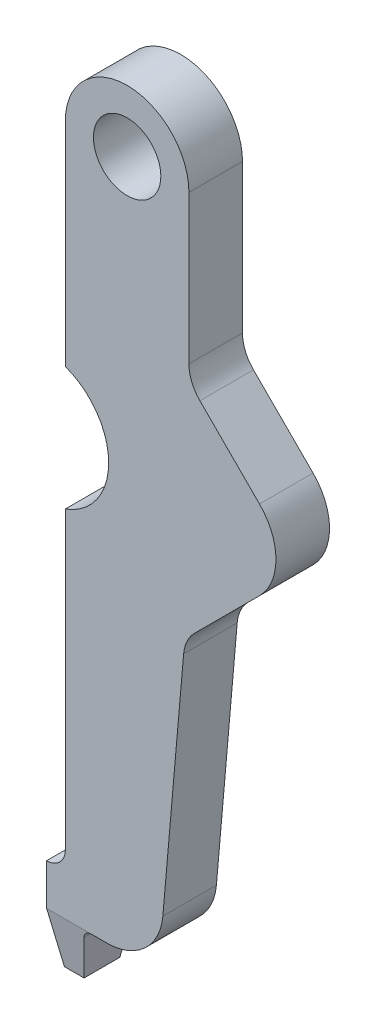
ISO-10303-21;
HEADER;
FILE_DESCRIPTION(('STEP AP214'),'2;1');
FILE_NAME('part.step','',(''),(''),'','','');
FILE_SCHEMA(('AUTOMOTIVE_DESIGN { 1 0 10303 214 1 1 1 1 }'));
ENDSEC;
DATA;
#1=APPLICATION_CONTEXT('core data for automotive mechanical design processes');
#2=APPLICATION_PROTOCOL_DEFINITION('international standard','automotive_design',2000,#1);
#3=PRODUCT_CONTEXT('',#1,'mechanical');
#4=PRODUCT('Part','Part','',(#3));
#5=PRODUCT_RELATED_PRODUCT_CATEGORY('part','',(#4));
#6=PRODUCT_DEFINITION_FORMATION('','',#4);
#7=PRODUCT_DEFINITION_CONTEXT('part definition',#1,'design');
#8=PRODUCT_DEFINITION('design','',#6,#7);
#9=PRODUCT_DEFINITION_SHAPE('','',#8);
#10=(LENGTH_UNIT() NAMED_UNIT(*) SI_UNIT(.MILLI.,.METRE.));
#11=(NAMED_UNIT(*) PLANE_ANGLE_UNIT() SI_UNIT($,.RADIAN.));
#12=(NAMED_UNIT(*) SI_UNIT($,.STERADIAN.) SOLID_ANGLE_UNIT());
#13=UNCERTAINTY_MEASURE_WITH_UNIT(LENGTH_MEASURE(1.E-05),#10,'distance_accuracy_value','');
#14=(GEOMETRIC_REPRESENTATION_CONTEXT(3) GLOBAL_UNCERTAINTY_ASSIGNED_CONTEXT((#13)) GLOBAL_UNIT_ASSIGNED_CONTEXT((#10,
#11,#12)) REPRESENTATION_CONTEXT('',''));
#15=CARTESIAN_POINT('',(0.,0.,0.));
#16=DIRECTION('',(0.,0.,1.));
#17=DIRECTION('',(1.,0.,0.));
#18=AXIS2_PLACEMENT_3D('',#15,#16,#17);
#19=CARTESIAN_POINT('',(0.,0.,1.8161));
#20=DIRECTION('',(1.,0.,0.));
#21=DIRECTION('',(0.,0.,-1.));
#22=AXIS2_PLACEMENT_3D('',#19,#20,#21);
#23=PLANE('',#22);
#24=DIRECTION('',(0.,-1.,0.));
#25=VECTOR('',#24,1.);
#26=CARTESIAN_POINT('',(0.,0.,-1.8161));
#27=LINE('',#26,#25);
#28=CARTESIAN_POINT('',(0.,44.069,-1.8161));
#29=VERTEX_POINT('',#28);
#30=CARTESIAN_POINT('',(0.,29.6532687366891,-1.8161));
#31=VERTEX_POINT('',#30);
#32=EDGE_CURVE('E183',#29,#31,#27,.T.);
#33=ORIENTED_EDGE('',*,*,#32,.T.);
#34=DIRECTION('',(0.,0.,1.));
#35=VECTOR('',#34,1.);
#36=CARTESIAN_POINT('',(0.,29.6532687366891,-1.8161));
#37=LINE('',#36,#35);
#38=CARTESIAN_POINT('',(0.,29.6532687366891,1.8161));
#39=VERTEX_POINT('',#38);
#40=EDGE_CURVE('E54',#31,#39,#37,.T.);
#41=ORIENTED_EDGE('',*,*,#40,.T.);
#42=DIRECTION('',(0.,-1.,0.));
#43=VECTOR('',#42,1.);
#44=CARTESIAN_POINT('',(0.,0.,1.8161));
#45=LINE('',#44,#43);
#46=CARTESIAN_POINT('',(0.,44.069,1.8161));
#47=VERTEX_POINT('',#46);
#48=EDGE_CURVE('E196',#47,#39,#45,.T.);
#49=ORIENTED_EDGE('',*,*,#48,.F.);
#50=DIRECTION('',(0.,0.,-1.));
#51=VECTOR('',#50,1.);
#52=CARTESIAN_POINT('',(0.,44.069,1.8161));
#53=LINE('',#52,#51);
#54=EDGE_CURVE('E199',#47,#29,#53,.T.);
#55=ORIENTED_EDGE('',*,*,#54,.T.);
#56=EDGE_LOOP('',(#33,#41,#49,#55));
#57=FACE_BOUND('',#56,.T.);
#58=ADVANCED_FACE('F37',(#57),#23,.F.);
#59=CARTESIAN_POINT('',(6.5532,-2.794,1.8161));
#60=DIRECTION('',(0.,1.,0.));
#61=DIRECTION('',(-1.,0.,0.));
#62=AXIS2_PLACEMENT_3D('',#59,#60,#61);
#63=PLANE('',#62);
#64=DIRECTION('',(-1.,0.,0.));
#65=VECTOR('',#64,1.);
#66=CARTESIAN_POINT('',(6.5532,-2.794,1.8161));
#67=LINE('',#66,#65);
#68=CARTESIAN_POINT('',(2.81753490110218,-2.794,1.8161));
#69=VERTEX_POINT('',#68);
#70=CARTESIAN_POINT('',(1.80282826579757,-2.794,1.8161));
#71=VERTEX_POINT('',#70);
#72=EDGE_CURVE('E247',#69,#71,#67,.T.);
#73=ORIENTED_EDGE('',*,*,#72,.T.);
#74=DIRECTION('',(0.,0.,-1.));
#75=VECTOR('',#74,1.);
#76=CARTESIAN_POINT('',(1.80282826579757,-2.794,-1.8161));
#77=LINE('',#76,#75);
#78=CARTESIAN_POINT('',(1.80282826579757,-2.794,-1.8161));
#79=VERTEX_POINT('',#78);
#80=EDGE_CURVE('E223',#71,#79,#77,.T.);
#81=ORIENTED_EDGE('',*,*,#80,.T.);
#82=DIRECTION('',(1.,0.,0.));
#83=VECTOR('',#82,1.);
#84=CARTESIAN_POINT('',(6.5532,-2.794,-1.8161));
#85=LINE('',#84,#83);
#86=CARTESIAN_POINT('',(2.81753490110218,-2.794,-1.8161));
#87=VERTEX_POINT('',#86);
#88=EDGE_CURVE('E207',#79,#87,#85,.T.);
#89=ORIENTED_EDGE('',*,*,#88,.T.);
#90=DIRECTION('',(0.,0.,1.));
#91=VECTOR('',#90,1.);
#92=CARTESIAN_POINT('',(2.81753490110218,-2.794,1.8161));
#93=LINE('',#92,#91);
#94=EDGE_CURVE('E278',#87,#69,#93,.T.);
#95=ORIENTED_EDGE('',*,*,#94,.T.);
#96=EDGE_LOOP('',(#73,#81,#89,#95));
#97=FACE_BOUND('',#96,.T.);
#98=ADVANCED_FACE('F313',(#97),#63,.F.);
#99=CARTESIAN_POINT('',(8.10282910605329,17.7123417320712,1.8161));
#100=DIRECTION('',(-0.996194698091746,0.0871557427476543,0.));
#101=DIRECTION('',(-0.0871557427476543,-0.996194698091746,0.));
#102=AXIS2_PLACEMENT_3D('',#99,#100,#101);
#103=PLANE('',#102);
#104=DIRECTION('',(0.0871557427476543,0.996194698091746,0.));
#105=VECTOR('',#104,1.);
#106=CARTESIAN_POINT('',(8.10282910605329,17.7123417320712,1.8161));
#107=LINE('',#106,#105);
#108=CARTESIAN_POINT('',(6.61303670083174,0.683936620131439,1.8161));
#109=VERTEX_POINT('',#108);
#110=CARTESIAN_POINT('',(8.0222549819453,16.7913752792676,1.8161));
#111=VERTEX_POINT('',#110);
#112=EDGE_CURVE('E186',#109,#111,#107,.T.);
#113=ORIENTED_EDGE('',*,*,#112,.F.);
#114=DIRECTION('',(0.,0.,1.));
#115=VECTOR('',#114,1.);
#116=CARTESIAN_POINT('',(6.61303670083173,0.683936620131435,1.8161));
#117=LINE('',#116,#115);
#118=CARTESIAN_POINT('',(6.61303670083174,0.683936620131439,-1.8161));
#119=VERTEX_POINT('',#118);
#120=EDGE_CURVE('E284',#109,#119,#117,.F.);
#121=ORIENTED_EDGE('',*,*,#120,.T.);
#122=DIRECTION('',(0.0871557427476543,0.996194698091746,0.));
#123=VECTOR('',#122,1.);
#124=CARTESIAN_POINT('',(8.10282910605329,17.7123417320712,-1.8161));
#125=LINE('',#124,#123);
#126=CARTESIAN_POINT('',(8.0222549819453,16.7913752792676,-1.8161));
#127=VERTEX_POINT('',#126);
#128=EDGE_CURVE('E245',#119,#127,#125,.T.);
#129=ORIENTED_EDGE('',*,*,#128,.T.);
#130=DIRECTION('',(0.,0.,-1.));
#131=VECTOR('',#130,1.);
#132=CARTESIAN_POINT('',(8.0222549819453,16.7913752792676,1.8161));
#133=LINE('',#132,#131);
#134=EDGE_CURVE('E352',#127,#111,#133,.F.);
#135=ORIENTED_EDGE('',*,*,#134,.T.);
#136=EDGE_LOOP('',(#113,#121,#129,#135));
#137=FACE_BOUND('',#136,.T.);
#138=ADVANCED_FACE('F398',(#137),#103,.F.);
#139=CARTESIAN_POINT('',(8.10282910605329,17.7123417320712,1.8161));
#140=DIRECTION('',(-0.707106781186544,0.707106781186551,0.));
#141=DIRECTION('',(-0.707106781186551,-0.707106781186544,0.));
#142=AXIS2_PLACEMENT_3D('',#139,#140,#141);
#143=PLANE('',#142);
#144=DIRECTION('',(0.707106781186551,0.707106781186544,0.));
#145=VECTOR('',#144,1.);
#146=CARTESIAN_POINT('',(8.10282910605329,17.7123417320712,1.8161));
#147=LINE('',#146,#145);
#148=CARTESIAN_POINT('',(8.75653829088451,18.3660509169024,1.8161));
#149=VERTEX_POINT('',#148);
#150=CARTESIAN_POINT('',(13.1670591253803,22.7765717513982,1.8161));
#151=VERTEX_POINT('',#150);
#152=EDGE_CURVE('E317',#149,#151,#147,.T.);
#153=ORIENTED_EDGE('',*,*,#152,.F.);
#154=DIRECTION('',(0.,0.,-1.));
#155=VECTOR('',#154,1.);
#156=CARTESIAN_POINT('',(8.75653829088451,18.3660509169024,-1.8161));
#157=LINE('',#156,#155);
#158=CARTESIAN_POINT('',(8.75653829088451,18.3660509169024,-1.8161));
#159=VERTEX_POINT('',#158);
#160=EDGE_CURVE('E349',#149,#159,#157,.T.);
#161=ORIENTED_EDGE('',*,*,#160,.T.);
#162=DIRECTION('',(0.707106781186551,0.707106781186544,0.));
#163=VECTOR('',#162,1.);
#164=CARTESIAN_POINT('',(8.10282910605329,17.7123417320712,-1.8161));
#165=LINE('',#164,#163);
#166=CARTESIAN_POINT('',(13.1670591253803,22.7765717513982,-1.8161));
#167=VERTEX_POINT('',#166);
#168=EDGE_CURVE('E327',#159,#167,#165,.T.);
#169=ORIENTED_EDGE('',*,*,#168,.T.);
#170=DIRECTION('',(0.,0.,-1.));
#171=VECTOR('',#170,1.);
#172=CARTESIAN_POINT('',(13.1670591253803,22.7765717513982,1.8161));
#173=LINE('',#172,#171);
#174=EDGE_CURVE('E344',#167,#151,#173,.F.);
#175=ORIENTED_EDGE('',*,*,#174,.T.);
#176=EDGE_LOOP('',(#153,#161,#169,#175));
#177=FACE_BOUND('',#176,.T.);
#178=ADVANCED_FACE('F391',(#177),#143,.F.);
#179=CARTESIAN_POINT('',(15.861135961701,25.4706485877189,1.8161));
#180=DIRECTION('',(-0.707106781186551,-0.707106781186544,0.));
#181=DIRECTION('',(0.707106781186544,-0.707106781186551,0.));
#182=AXIS2_PLACEMENT_3D('',#179,#180,#181);
#183=PLANE('',#182);
#184=DIRECTION('',(-0.707106781186544,0.707106781186551,0.));
#185=VECTOR('',#184,1.);
#186=CARTESIAN_POINT('',(15.861135961701,25.4706485877189,-1.8161));
#187=LINE('',#186,#185);
#188=CARTESIAN_POINT('',(13.1670591253803,28.1647254240396,-1.8161));
#189=VERTEX_POINT('',#188);
#190=CARTESIAN_POINT('',(9.12594877578616,32.2058357736338,-1.8161));
#191=VERTEX_POINT('',#190);
#192=EDGE_CURVE('E329',#189,#191,#187,.T.);
#193=ORIENTED_EDGE('',*,*,#192,.T.);
#194=DIRECTION('',(0.,0.,-1.));
#195=VECTOR('',#194,1.);
#196=CARTESIAN_POINT('',(9.12594877578616,32.2058357736338,1.8161));
#197=LINE('',#196,#195);
#198=CARTESIAN_POINT('',(9.12594877578616,32.2058357736338,1.8161));
#199=VERTEX_POINT('',#198);
#200=EDGE_CURVE('E358',#191,#199,#197,.F.);
#201=ORIENTED_EDGE('',*,*,#200,.T.);
#202=DIRECTION('',(-0.707106781186544,0.707106781186551,0.));
#203=VECTOR('',#202,1.);
#204=CARTESIAN_POINT('',(15.861135961701,25.4706485877189,1.8161));
#205=LINE('',#204,#203);
#206=CARTESIAN_POINT('',(13.1670591253803,28.1647254240396,1.8161));
#207=VERTEX_POINT('',#206);
#208=EDGE_CURVE('E319',#207,#199,#205,.T.);
#209=ORIENTED_EDGE('',*,*,#208,.F.);
#210=DIRECTION('',(0.,0.,-1.));
#211=VECTOR('',#210,1.);
#212=CARTESIAN_POINT('',(13.1670591253803,28.1647254240396,1.8161));
#213=LINE('',#212,#211);
#214=EDGE_CURVE('E338',#207,#189,#213,.T.);
#215=ORIENTED_EDGE('',*,*,#214,.T.);
#216=EDGE_LOOP('',(#193,#201,#209,#215));
#217=FACE_BOUND('',#216,.T.);
#218=ADVANCED_FACE('F381',(#217),#183,.F.);
#219=CARTESIAN_POINT('',(8.382,44.069,1.8161));
#220=DIRECTION('',(-1.,0.,0.));
#221=DIRECTION('',(0.,-1.,0.));
#222=AXIS2_PLACEMENT_3D('',#219,#220,#221);
#223=PLANE('',#222);
#224=DIRECTION('',(0.,1.,0.));
#225=VECTOR('',#224,1.);
#226=CARTESIAN_POINT('',(8.382,44.069,1.8161));
#227=LINE('',#226,#225);
#228=CARTESIAN_POINT('',(8.382,34.0018869978476,1.8161));
#229=VERTEX_POINT('',#228);
#230=CARTESIAN_POINT('',(8.382,44.069,1.8161));
#231=VERTEX_POINT('',#230);
#232=EDGE_CURVE('E322',#229,#231,#227,.T.);
#233=ORIENTED_EDGE('',*,*,#232,.F.);
#234=DIRECTION('',(0.,0.,-1.));
#235=VECTOR('',#234,1.);
#236=CARTESIAN_POINT('',(8.382,34.0018869978476,-1.8161));
#237=LINE('',#236,#235);
#238=CARTESIAN_POINT('',(8.382,34.0018869978476,-1.8161));
#239=VERTEX_POINT('',#238);
#240=EDGE_CURVE('E355',#229,#239,#237,.T.);
#241=ORIENTED_EDGE('',*,*,#240,.T.);
#242=DIRECTION('',(0.,1.,0.));
#243=VECTOR('',#242,1.);
#244=CARTESIAN_POINT('',(8.382,44.069,-1.8161));
#245=LINE('',#244,#243);
#246=CARTESIAN_POINT('',(8.382,44.069,-1.8161));
#247=VERTEX_POINT('',#246);
#248=EDGE_CURVE('E188',#239,#247,#245,.T.);
#249=ORIENTED_EDGE('',*,*,#248,.T.);
#250=DIRECTION('',(0.,0.,-1.));
#251=VECTOR('',#250,1.);
#252=CARTESIAN_POINT('',(8.382,44.069,1.8161));
#253=LINE('',#252,#251);
#254=EDGE_CURVE('E335',#231,#247,#253,.T.);
#255=ORIENTED_EDGE('',*,*,#254,.F.);
#256=EDGE_LOOP('',(#233,#241,#249,#255));
#257=FACE_BOUND('',#256,.T.);
#258=ADVANCED_FACE('F374',(#257),#223,.F.);
#259=CARTESIAN_POINT('',(4.191,44.069,1.8161));
#260=DIRECTION('',(0.,0.,-1.));
#261=DIRECTION('',(-1.,0.,0.));
#262=AXIS2_PLACEMENT_3D('',#259,#260,#261);
#263=CYLINDRICAL_SURFACE('',#262,4.191);
#264=CARTESIAN_POINT('',(4.191,44.069,-1.8161));
#265=DIRECTION('',(0.,0.,1.));
#266=DIRECTION('',(1.,0.,0.));
#267=AXIS2_PLACEMENT_3D('',#264,#265,#266);
#268=CIRCLE('',#267,4.191);
#269=EDGE_CURVE('E184',#247,#29,#268,.T.);
#270=ORIENTED_EDGE('',*,*,#269,.T.);
#271=ORIENTED_EDGE('',*,*,#54,.F.);
#272=CARTESIAN_POINT('',(4.191,44.069,1.8161));
#273=DIRECTION('',(0.,0.,1.));
#274=DIRECTION('',(1.,0.,0.));
#275=AXIS2_PLACEMENT_3D('',#272,#273,#274);
#276=CIRCLE('',#275,4.191);
#277=EDGE_CURVE('E324',#231,#47,#276,.T.);
#278=ORIENTED_EDGE('',*,*,#277,.F.);
#279=ORIENTED_EDGE('',*,*,#254,.T.);
#280=EDGE_LOOP('',(#270,#271,#278,#279));
#281=FACE_BOUND('',#280,.T.);
#282=ADVANCED_FACE('F417',(#281),#263,.T.);
#283=CARTESIAN_POINT('',(0.,21.2880284387488,1.8161));
#284=VERTEX_POINT('',#283);
#285=CARTESIAN_POINT('',(0.,1.27,1.8161));
#286=VERTEX_POINT('',#285);
#287=EDGE_CURVE('E41',#284,#286,#45,.T.);
#288=ORIENTED_EDGE('',*,*,#287,.F.);
#289=DIRECTION('',(0.,0.,1.));
#290=VECTOR('',#289,1.);
#291=CARTESIAN_POINT('',(0.,21.2880284387488,-1.8161));
#292=LINE('',#291,#290);
#293=CARTESIAN_POINT('',(0.,21.2880284387488,-1.8161));
#294=VERTEX_POINT('',#293);
#295=EDGE_CURVE('E168',#284,#294,#292,.F.);
#296=ORIENTED_EDGE('',*,*,#295,.T.);
#297=CARTESIAN_POINT('',(0.,1.27,-1.8161));
#298=VERTEX_POINT('',#297);
#299=EDGE_CURVE('E175',#294,#298,#27,.T.);
#300=ORIENTED_EDGE('',*,*,#299,.T.);
#301=DIRECTION('',(0.,0.,-1.));
#302=VECTOR('',#301,1.);
#303=CARTESIAN_POINT('',(0.,1.27,1.8161));
#304=LINE('',#303,#302);
#305=EDGE_CURVE('E231',#298,#286,#304,.F.);
#306=ORIENTED_EDGE('',*,*,#305,.T.);
#307=EDGE_LOOP('',(#288,#296,#300,#306));
#308=FACE_BOUND('',#307,.T.);
#309=ADVANCED_FACE('F174',(#308),#23,.F.);
#310=CARTESIAN_POINT('',(4.191,44.069,1.8161));
#311=DIRECTION('',(0.,0.,1.));
#312=DIRECTION('',(1.,0.,0.));
#313=AXIS2_PLACEMENT_3D('',#310,#311,#312);
#314=PLANE('',#313);
#315=CARTESIAN_POINT('',(-1.50456428557533,25.4706485877189,1.8161));
#316=DIRECTION('',(0.,0.,1.));
#317=DIRECTION('',(1.,0.,0.));
#318=AXIS2_PLACEMENT_3D('',#315,#316,#317);
#319=CIRCLE('',#318,4.445);
#320=EDGE_CURVE('E177',#284,#39,#319,.T.);
#321=ORIENTED_EDGE('',*,*,#320,.F.);
#322=ORIENTED_EDGE('',*,*,#287,.T.);
#323=CARTESIAN_POINT('',(-1.27,1.27,1.8161));
#324=DIRECTION('',(0.,0.,1.));
#325=DIRECTION('',(1.,0.,0.));
#326=AXIS2_PLACEMENT_3D('',#323,#324,#325);
#327=CIRCLE('',#326,1.27);
#328=CARTESIAN_POINT('',(-1.27,0.,1.8161));
#329=VERTEX_POINT('',#328);
#330=EDGE_CURVE('E47',#286,#329,#327,.F.);
#331=ORIENTED_EDGE('',*,*,#330,.T.);
#332=DIRECTION('',(0.,1.,0.));
#333=VECTOR('',#332,1.);
#334=CARTESIAN_POINT('',(-1.27,-2.794,1.8161));
#335=LINE('',#334,#333);
#336=CARTESIAN_POINT('',(-1.27,-2.794,1.8161));
#337=VERTEX_POINT('',#336);
#338=EDGE_CURVE('E236',#337,#329,#335,.T.);
#339=ORIENTED_EDGE('',*,*,#338,.F.);
#340=DIRECTION('',(-1.,0.,0.));
#341=VECTOR('',#340,1.);
#342=CARTESIAN_POINT('',(-1.27,-2.794,1.8161));
#343=LINE('',#342,#341);
#344=EDGE_CURVE('E270',#71,#337,#343,.T.);
#345=ORIENTED_EDGE('',*,*,#344,.F.);
#346=ORIENTED_EDGE('',*,*,#72,.F.);
#347=CARTESIAN_POINT('',(2.81753490110218,1.016,1.8161));
#348=DIRECTION('',(0.,0.,1.));
#349=DIRECTION('',(1.,0.,0.));
#350=AXIS2_PLACEMENT_3D('',#347,#348,#349);
#351=CIRCLE('',#350,3.81);
#352=EDGE_CURVE('E281',#69,#109,#351,.T.);
#353=ORIENTED_EDGE('',*,*,#352,.T.);
#354=ORIENTED_EDGE('',*,*,#112,.T.);
#355=CARTESIAN_POINT('',(10.5525895150983,16.5699996926886,1.8161));
#356=DIRECTION('',(0.,0.,1.));
#357=DIRECTION('',(1.,0.,0.));
#358=AXIS2_PLACEMENT_3D('',#355,#356,#357);
#359=CIRCLE('',#358,2.54);
#360=EDGE_CURVE('E363',#111,#149,#359,.F.);
#361=ORIENTED_EDGE('',*,*,#360,.T.);
#362=ORIENTED_EDGE('',*,*,#152,.T.);
#363=CARTESIAN_POINT('',(10.4729822890595,25.4706485877189,1.8161));
#364=DIRECTION('',(0.,0.,1.));
#365=DIRECTION('',(1.,0.,0.));
#366=AXIS2_PLACEMENT_3D('',#363,#364,#365);
#367=CIRCLE('',#366,3.81);
#368=EDGE_CURVE('E347',#151,#207,#367,.T.);
#369=ORIENTED_EDGE('',*,*,#368,.T.);
#370=ORIENTED_EDGE('',*,*,#208,.T.);
#371=CARTESIAN_POINT('',(10.922,34.0018869978476,1.8161));
#372=DIRECTION('',(0.,0.,1.));
#373=DIRECTION('',(1.,0.,0.));
#374=AXIS2_PLACEMENT_3D('',#371,#372,#373);
#375=CIRCLE('',#374,2.54);
#376=EDGE_CURVE('E282',#199,#229,#375,.F.);
#377=ORIENTED_EDGE('',*,*,#376,.T.);
#378=ORIENTED_EDGE('',*,*,#232,.T.);
#379=ORIENTED_EDGE('',*,*,#277,.T.);
#380=ORIENTED_EDGE('',*,*,#48,.T.);
#381=EDGE_LOOP('',(#321,#322,#331,#339,#345,#346,#353,#354,#361,#362,#369,#370,#377,#378,#379,#380));
#382=FACE_BOUND('',#381,.T.);
#383=CARTESIAN_POINT('',(4.191,44.069,1.8161));
#384=DIRECTION('',(0.,0.,1.));
#385=DIRECTION('',(1.,0.,0.));
#386=AXIS2_PLACEMENT_3D('',#383,#384,#385);
#387=CIRCLE('',#386,2.286);
#388=CARTESIAN_POINT('',(6.477,44.069,1.8161));
#389=VERTEX_POINT('',#388);
#390=EDGE_CURVE('E260',#389,#389,#387,.T.);
#391=ORIENTED_EDGE('',*,*,#390,.F.);
#392=EDGE_LOOP('',(#391));
#393=FACE_BOUND('',#392,.T.);
#394=ADVANCED_FACE('F234',(#382,#393),#314,.T.);
#395=CARTESIAN_POINT('',(4.191,44.069,-1.8161));
#396=DIRECTION('',(0.,0.,1.));
#397=DIRECTION('',(1.,0.,0.));
#398=AXIS2_PLACEMENT_3D('',#395,#396,#397);
#399=PLANE('',#398);
#400=CARTESIAN_POINT('',(4.191,44.069,-1.8161));
#401=DIRECTION('',(0.,0.,1.));
#402=DIRECTION('',(1.,0.,0.));
#403=AXIS2_PLACEMENT_3D('',#400,#401,#402);
#404=CIRCLE('',#403,2.286);
#405=CARTESIAN_POINT('',(6.477,44.069,-1.8161));
#406=VERTEX_POINT('',#405);
#407=EDGE_CURVE('E402',#406,#406,#404,.T.);
#408=ORIENTED_EDGE('',*,*,#407,.T.);
#409=EDGE_LOOP('',(#408));
#410=FACE_BOUND('',#409,.T.);
#411=ORIENTED_EDGE('',*,*,#299,.F.);
#412=CARTESIAN_POINT('',(-1.50456428557533,25.4706485877189,-1.8161));
#413=DIRECTION('',(0.,0.,1.));
#414=DIRECTION('',(1.,0.,0.));
#415=AXIS2_PLACEMENT_3D('',#412,#413,#414);
#416=CIRCLE('',#415,4.445);
#417=EDGE_CURVE('E11',#294,#31,#416,.T.);
#418=ORIENTED_EDGE('',*,*,#417,.T.);
#419=ORIENTED_EDGE('',*,*,#32,.F.);
#420=ORIENTED_EDGE('',*,*,#269,.F.);
#421=ORIENTED_EDGE('',*,*,#248,.F.);
#422=CARTESIAN_POINT('',(10.922,34.0018869978476,-1.8161));
#423=DIRECTION('',(0.,0.,1.));
#424=DIRECTION('',(1.,0.,0.));
#425=AXIS2_PLACEMENT_3D('',#422,#423,#424);
#426=CIRCLE('',#425,2.54);
#427=EDGE_CURVE('E365',#239,#191,#426,.T.);
#428=ORIENTED_EDGE('',*,*,#427,.T.);
#429=ORIENTED_EDGE('',*,*,#192,.F.);
#430=CARTESIAN_POINT('',(10.4729822890595,25.4706485877189,-1.8161));
#431=DIRECTION('',(0.,0.,1.));
#432=DIRECTION('',(1.,0.,0.));
#433=AXIS2_PLACEMENT_3D('',#430,#431,#432);
#434=CIRCLE('',#433,3.81);
#435=EDGE_CURVE('E341',#189,#167,#434,.F.);
#436=ORIENTED_EDGE('',*,*,#435,.T.);
#437=ORIENTED_EDGE('',*,*,#168,.F.);
#438=CARTESIAN_POINT('',(10.5525895150983,16.5699996926886,-1.8161));
#439=DIRECTION('',(0.,0.,1.));
#440=DIRECTION('',(1.,0.,0.));
#441=AXIS2_PLACEMENT_3D('',#438,#439,#440);
#442=CIRCLE('',#441,2.54);
#443=EDGE_CURVE('E360',#159,#127,#442,.T.);
#444=ORIENTED_EDGE('',*,*,#443,.T.);
#445=ORIENTED_EDGE('',*,*,#128,.F.);
#446=CARTESIAN_POINT('',(2.81753490110218,1.016,-1.8161));
#447=DIRECTION('',(0.,0.,1.));
#448=DIRECTION('',(1.,0.,0.));
#449=AXIS2_PLACEMENT_3D('',#446,#447,#448);
#450=CIRCLE('',#449,3.81);
#451=EDGE_CURVE('E285',#119,#87,#450,.F.);
#452=ORIENTED_EDGE('',*,*,#451,.T.);
#453=ORIENTED_EDGE('',*,*,#88,.F.);
#454=CARTESIAN_POINT('',(-1.27,-2.794,-1.8161));
#455=VERTEX_POINT('',#454);
#456=EDGE_CURVE('E202',#455,#79,#85,.T.);
#457=ORIENTED_EDGE('',*,*,#456,.F.);
#458=DIRECTION('',(0.,1.,0.));
#459=VECTOR('',#458,1.);
#460=CARTESIAN_POINT('',(-1.27,-2.794,-1.8161));
#461=LINE('',#460,#459);
#462=CARTESIAN_POINT('',(-1.27,0.,-1.8161));
#463=VERTEX_POINT('',#462);
#464=EDGE_CURVE('E206',#455,#463,#461,.T.);
#465=ORIENTED_EDGE('',*,*,#464,.T.);
#466=CARTESIAN_POINT('',(-1.27,1.27,-1.8161));
#467=DIRECTION('',(0.,0.,1.));
#468=DIRECTION('',(1.,0.,0.));
#469=AXIS2_PLACEMENT_3D('',#466,#467,#468);
#470=CIRCLE('',#469,1.27);
#471=EDGE_CURVE('E181',#463,#298,#470,.T.);
#472=ORIENTED_EDGE('',*,*,#471,.T.);
#473=EDGE_LOOP('',(#411,#418,#419,#420,#421,#428,#429,#436,#437,#444,#445,#452,#453,#457,#465,#472));
#474=FACE_BOUND('',#473,.T.);
#475=ADVANCED_FACE('F179',(#410,#474),#399,.F.);
#476=CARTESIAN_POINT('',(10.4729822890595,25.4706485877189,1.8161));
#477=DIRECTION('',(0.,0.,-1.));
#478=DIRECTION('',(-1.,0.,0.));
#479=AXIS2_PLACEMENT_3D('',#476,#477,#478);
#480=CYLINDRICAL_SURFACE('',#479,3.81);
#481=ORIENTED_EDGE('',*,*,#368,.F.);
#482=ORIENTED_EDGE('',*,*,#174,.F.);
#483=ORIENTED_EDGE('',*,*,#435,.F.);
#484=ORIENTED_EDGE('',*,*,#214,.F.);
#485=EDGE_LOOP('',(#481,#482,#483,#484));
#486=FACE_BOUND('',#485,.T.);
#487=ADVANCED_FACE('F385',(#486),#480,.T.);
#488=CARTESIAN_POINT('',(10.5525895150983,16.5699996926886,1.8161));
#489=DIRECTION('',(0.,0.,1.));
#490=DIRECTION('',(1.,0.,0.));
#491=AXIS2_PLACEMENT_3D('',#488,#489,#490);
#492=CYLINDRICAL_SURFACE('',#491,2.54);
#493=ORIENTED_EDGE('',*,*,#360,.F.);
#494=ORIENTED_EDGE('',*,*,#134,.F.);
#495=ORIENTED_EDGE('',*,*,#443,.F.);
#496=ORIENTED_EDGE('',*,*,#160,.F.);
#497=EDGE_LOOP('',(#493,#494,#495,#496));
#498=FACE_BOUND('',#497,.T.);
#499=ADVANCED_FACE('F395',(#498),#492,.F.);
#500=CARTESIAN_POINT('',(10.922,34.0018869978476,1.8161));
#501=DIRECTION('',(0.,0.,1.));
#502=DIRECTION('',(1.,0.,0.));
#503=AXIS2_PLACEMENT_3D('',#500,#501,#502);
#504=CYLINDRICAL_SURFACE('',#503,2.54);
#505=ORIENTED_EDGE('',*,*,#376,.F.);
#506=ORIENTED_EDGE('',*,*,#200,.F.);
#507=ORIENTED_EDGE('',*,*,#427,.F.);
#508=ORIENTED_EDGE('',*,*,#240,.F.);
#509=EDGE_LOOP('',(#505,#506,#507,#508));
#510=FACE_BOUND('',#509,.T.);
#511=ADVANCED_FACE('F377',(#510),#504,.F.);
#512=CARTESIAN_POINT('',(-1.27,-2.794,1.8161));
#513=DIRECTION('',(1.,0.,0.));
#514=DIRECTION('',(0.,0.,-1.));
#515=AXIS2_PLACEMENT_3D('',#512,#513,#514);
#516=PLANE('',#515);
#517=DIRECTION('',(0.,0.,-1.));
#518=VECTOR('',#517,1.);
#519=CARTESIAN_POINT('',(-1.27,0.,1.8161));
#520=LINE('',#519,#518);
#521=EDGE_CURVE('E215',#329,#463,#520,.T.);
#522=ORIENTED_EDGE('',*,*,#521,.T.);
#523=ORIENTED_EDGE('',*,*,#464,.F.);
#524=DIRECTION('',(0.,0.,-1.));
#525=VECTOR('',#524,1.);
#526=CARTESIAN_POINT('',(-1.27,-2.794,1.8161));
#527=LINE('',#526,#525);
#528=EDGE_CURVE('E213',#337,#455,#527,.T.);
#529=ORIENTED_EDGE('',*,*,#528,.F.);
#530=ORIENTED_EDGE('',*,*,#338,.T.);
#531=EDGE_LOOP('',(#522,#523,#529,#530));
#532=FACE_BOUND('',#531,.T.);
#533=ADVANCED_FACE('F242',(#532),#516,.F.);
#534=CARTESIAN_POINT('',(-1.27,-2.794,1.8161));
#535=DIRECTION('',(-0.984807753012208,-0.17364817766693,0.));
#536=DIRECTION('',(0.17364817766693,-0.984807753012208,0.));
#537=AXIS2_PLACEMENT_3D('',#534,#535,#536);
#538=PLANE('',#537);
#539=ORIENTED_EDGE('',*,*,#528,.T.);
#540=DIRECTION('',(-0.171087869746035,0.970287525247814,-0.171087869746036));
#541=VECTOR('',#540,1.);
#542=CARTESIAN_POINT('',(-1.27,-2.794,-1.8161));
#543=LINE('',#542,#541);
#544=CARTESIAN_POINT('',(-0.665374783150675,-6.223,-1.21147478315067));
#545=VERTEX_POINT('',#544);
#546=EDGE_CURVE('E248',#545,#455,#543,.T.);
#547=ORIENTED_EDGE('',*,*,#546,.F.);
#548=DIRECTION('',(0.,0.,1.));
#549=VECTOR('',#548,1.);
#550=CARTESIAN_POINT('',(-0.665374783150675,-6.223,1.8161));
#551=LINE('',#550,#549);
#552=CARTESIAN_POINT('',(-0.665374783150675,-6.223,1.21147478315067));
#553=VERTEX_POINT('',#552);
#554=EDGE_CURVE('E266',#553,#545,#551,.F.);
#555=ORIENTED_EDGE('',*,*,#554,.F.);
#556=DIRECTION('',(-0.171087869746035,0.970287525247814,0.171087869746036));
#557=VECTOR('',#556,1.);
#558=CARTESIAN_POINT('',(-1.27,-2.794,1.8161));
#559=LINE('',#558,#557);
#560=EDGE_CURVE('E262',#553,#337,#559,.T.);
#561=ORIENTED_EDGE('',*,*,#560,.T.);
#562=EDGE_LOOP('',(#539,#547,#555,#561));
#563=FACE_BOUND('',#562,.T.);
#564=ADVANCED_FACE('F437',(#563),#538,.T.);
#565=CARTESIAN_POINT('',(-1.27,-2.794,-1.8161));
#566=DIRECTION('',(0.,-0.17364817766693,-0.984807753012208));
#567=DIRECTION('',(0.,0.984807753012208,-0.17364817766693));
#568=AXIS2_PLACEMENT_3D('',#565,#566,#567);
#569=PLANE('',#568);
#570=ORIENTED_EDGE('',*,*,#456,.T.);
#571=CARTESIAN_POINT('',(1.80282826579757,-3.429,-1.70413236725013));
#572=DIRECTION('',(0.,-0.17364817766693,-0.984807753012208));
#573=DIRECTION('',(0.,-0.984807753012208,0.17364817766693));
#574=AXIS2_PLACEMENT_3D('',#571,#572,#573);
#575=ELLIPSE('',#574,0.644795898547448,0.635);
#576=CARTESIAN_POINT('',(1.17747534263482,-3.3187334071815,-1.72357534263482));
#577=VERTEX_POINT('',#576);
#578=EDGE_CURVE('E229',#79,#577,#575,.F.);
#579=ORIENTED_EDGE('',*,*,#578,.T.);
#580=DIRECTION('',(0.171087869746036,0.970287525247814,-0.171087869746036));
#581=VECTOR('',#580,1.);
#582=CARTESIAN_POINT('',(1.16368165886734,-3.39696127515758,-1.70978165886734));
#583=LINE('',#582,#581);
#584=CARTESIAN_POINT('',(0.665374783150673,-6.223,-1.21147478315067));
#585=VERTEX_POINT('',#584);
#586=EDGE_CURVE('E252',#585,#577,#583,.T.);
#587=ORIENTED_EDGE('',*,*,#586,.F.);
#588=DIRECTION('',(-1.,0.,0.));
#589=VECTOR('',#588,1.);
#590=CARTESIAN_POINT('',(-1.27,-6.223,-1.21147478315067));
#591=LINE('',#590,#589);
#592=EDGE_CURVE('E269',#545,#585,#591,.F.);
#593=ORIENTED_EDGE('',*,*,#592,.F.);
#594=ORIENTED_EDGE('',*,*,#546,.T.);
#595=EDGE_LOOP('',(#570,#579,#587,#593,#594));
#596=FACE_BOUND('',#595,.T.);
#597=ADVANCED_FACE('F309',(#596),#569,.T.);
#598=CARTESIAN_POINT('',(1.27,-2.794,1.8161));
#599=DIRECTION('',(0.984807753012208,-0.17364817766693,0.));
#600=DIRECTION('',(0.17364817766693,0.984807753012208,0.));
#601=AXIS2_PLACEMENT_3D('',#598,#599,#600);
#602=PLANE('',#601);
#603=ORIENTED_EDGE('',*,*,#586,.T.);
#604=DIRECTION('',(0.,0.,1.));
#605=VECTOR('',#604,1.);
#606=CARTESIAN_POINT('',(1.17747534263482,-3.3187334071815,1.8161));
#607=LINE('',#606,#605);
#608=CARTESIAN_POINT('',(1.17747534263482,-3.3187334071815,1.72357534263482));
#609=VERTEX_POINT('',#608);
#610=EDGE_CURVE('E221',#577,#609,#607,.T.);
#611=ORIENTED_EDGE('',*,*,#610,.T.);
#612=DIRECTION('',(0.171087869746036,0.970287525247814,0.171087869746036));
#613=VECTOR('',#612,1.);
#614=CARTESIAN_POINT('',(1.19565150969744,-3.21565124136894,1.74175150969744));
#615=LINE('',#614,#613);
#616=CARTESIAN_POINT('',(0.665374783150673,-6.223,1.21147478315067));
#617=VERTEX_POINT('',#616);
#618=EDGE_CURVE('E208',#617,#609,#615,.T.);
#619=ORIENTED_EDGE('',*,*,#618,.F.);
#620=DIRECTION('',(0.,0.,-1.));
#621=VECTOR('',#620,1.);
#622=CARTESIAN_POINT('',(0.665374783150673,-6.223,1.8161));
#623=LINE('',#622,#621);
#624=EDGE_CURVE('E272',#585,#617,#623,.F.);
#625=ORIENTED_EDGE('',*,*,#624,.F.);
#626=EDGE_LOOP('',(#603,#611,#619,#625));
#627=FACE_BOUND('',#626,.T.);
#628=ADVANCED_FACE('F296',(#627),#602,.T.);
#629=CARTESIAN_POINT('',(-1.27,-2.794,1.8161));
#630=DIRECTION('',(0.,-0.17364817766693,0.984807753012208));
#631=DIRECTION('',(0.,-0.984807753012208,-0.17364817766693));
#632=AXIS2_PLACEMENT_3D('',#629,#630,#631);
#633=PLANE('',#632);
#634=ORIENTED_EDGE('',*,*,#344,.T.);
#635=ORIENTED_EDGE('',*,*,#560,.F.);
#636=DIRECTION('',(1.,0.,0.));
#637=VECTOR('',#636,1.);
#638=CARTESIAN_POINT('',(-1.27,-6.223,1.21147478315067));
#639=LINE('',#638,#637);
#640=EDGE_CURVE('E265',#617,#553,#639,.F.);
#641=ORIENTED_EDGE('',*,*,#640,.F.);
#642=ORIENTED_EDGE('',*,*,#618,.T.);
#643=CARTESIAN_POINT('',(1.80282826579757,-3.429,1.70413236725012));
#644=DIRECTION('',(0.,-0.17364817766693,0.984807753012208));
#645=DIRECTION('',(0.,0.984807753012208,0.17364817766693));
#646=AXIS2_PLACEMENT_3D('',#643,#644,#645);
#647=ELLIPSE('',#646,0.644795898547448,0.635);
#648=EDGE_CURVE('E226',#609,#71,#647,.F.);
#649=ORIENTED_EDGE('',*,*,#648,.T.);
#650=EDGE_LOOP('',(#634,#635,#641,#642,#649));
#651=FACE_BOUND('',#650,.T.);
#652=ADVANCED_FACE('F303',(#651),#633,.T.);
#653=CARTESIAN_POINT('',(-1.27,-6.223,1.8161));
#654=DIRECTION('',(0.,-1.,0.));
#655=DIRECTION('',(0.,0.,-1.));
#656=AXIS2_PLACEMENT_3D('',#653,#654,#655);
#657=PLANE('',#656);
#658=ORIENTED_EDGE('',*,*,#554,.T.);
#659=ORIENTED_EDGE('',*,*,#592,.T.);
#660=ORIENTED_EDGE('',*,*,#624,.T.);
#661=ORIENTED_EDGE('',*,*,#640,.T.);
#662=EDGE_LOOP('',(#658,#659,#660,#661));
#663=FACE_BOUND('',#662,.T.);
#664=ADVANCED_FACE('F308',(#663),#657,.T.);
#665=CARTESIAN_POINT('',(2.81753490110218,1.016,1.8161));
#666=DIRECTION('',(0.,0.,1.));
#667=DIRECTION('',(0.,-1.,0.));
#668=AXIS2_PLACEMENT_3D('',#665,#666,#667);
#669=CYLINDRICAL_SURFACE('',#668,3.81);
#670=ORIENTED_EDGE('',*,*,#451,.F.);
#671=ORIENTED_EDGE('',*,*,#120,.F.);
#672=ORIENTED_EDGE('',*,*,#352,.F.);
#673=ORIENTED_EDGE('',*,*,#94,.F.);
#674=EDGE_LOOP('',(#670,#671,#672,#673));
#675=FACE_BOUND('',#674,.T.);
#676=ADVANCED_FACE('F401',(#675),#669,.T.);
#677=CARTESIAN_POINT('',(1.80282826579757,-3.429,1.8161));
#678=DIRECTION('',(0.,0.,1.));
#679=DIRECTION('',(1.,0.,0.));
#680=AXIS2_PLACEMENT_3D('',#677,#678,#679);
#681=CYLINDRICAL_SURFACE('',#680,0.635);
#682=ORIENTED_EDGE('',*,*,#578,.F.);
#683=ORIENTED_EDGE('',*,*,#80,.F.);
#684=ORIENTED_EDGE('',*,*,#648,.F.);
#685=ORIENTED_EDGE('',*,*,#610,.F.);
#686=EDGE_LOOP('',(#682,#683,#684,#685));
#687=FACE_BOUND('',#686,.T.);
#688=ADVANCED_FACE('F311',(#687),#681,.F.);
#689=CARTESIAN_POINT('',(-1.27,1.27,1.8161));
#690=DIRECTION('',(0.,0.,-1.));
#691=DIRECTION('',(0.,1.,0.));
#692=AXIS2_PLACEMENT_3D('',#689,#690,#691);
#693=CYLINDRICAL_SURFACE('',#692,1.27);
#694=ORIENTED_EDGE('',*,*,#330,.F.);
#695=ORIENTED_EDGE('',*,*,#305,.F.);
#696=ORIENTED_EDGE('',*,*,#471,.F.);
#697=ORIENTED_EDGE('',*,*,#521,.F.);
#698=EDGE_LOOP('',(#694,#695,#696,#697));
#699=FACE_BOUND('',#698,.T.);
#700=ADVANCED_FACE('F39',(#699),#693,.F.);
#701=CARTESIAN_POINT('',(4.191,44.069,-1.8161));
#702=DIRECTION('',(0.,0.,1.));
#703=DIRECTION('',(1.,0.,0.));
#704=AXIS2_PLACEMENT_3D('',#701,#702,#703);
#705=CYLINDRICAL_SURFACE('',#704,2.286);
#706=CARTESIAN_POINT('',(6.477,44.069,-1.8161));
#707=CARTESIAN_POINT('',(6.477,44.069,-1.77826458333333));
#708=CARTESIAN_POINT('',(6.477,44.069,-1.74042916666667));
#709=CARTESIAN_POINT('',(6.477,44.069,-1.66475833333333));
#710=CARTESIAN_POINT('',(6.477,44.069,-1.62692291666667));
#711=CARTESIAN_POINT('',(6.477,44.069,-1.55125208333333));
#712=CARTESIAN_POINT('',(6.477,44.069,-1.51341666666667));
#713=CARTESIAN_POINT('',(6.477,44.069,-1.43774583333333));
#714=CARTESIAN_POINT('',(6.477,44.069,-1.39991041666667));
#715=CARTESIAN_POINT('',(6.477,44.069,-1.32423958333333));
#716=CARTESIAN_POINT('',(6.477,44.069,-1.28640416666667));
#717=CARTESIAN_POINT('',(6.477,44.069,-1.21073333333333));
#718=CARTESIAN_POINT('',(6.477,44.069,-1.17289791666667));
#719=CARTESIAN_POINT('',(6.477,44.069,-1.09722708333333));
#720=CARTESIAN_POINT('',(6.477,44.069,-1.05939166666667));
#721=CARTESIAN_POINT('',(6.477,44.069,-0.983720833333334));
#722=CARTESIAN_POINT('',(6.477,44.069,-0.945885416666667));
#723=CARTESIAN_POINT('',(6.477,44.069,-0.870214583333334));
#724=CARTESIAN_POINT('',(6.477,44.069,-0.832379166666667));
#725=CARTESIAN_POINT('',(6.477,44.069,-0.756708333333334));
#726=CARTESIAN_POINT('',(6.477,44.069,-0.718872916666667));
#727=CARTESIAN_POINT('',(6.477,44.069,-0.643202083333334));
#728=CARTESIAN_POINT('',(6.477,44.069,-0.605366666666667));
#729=CARTESIAN_POINT('',(6.477,44.069,-0.529695833333334));
#730=CARTESIAN_POINT('',(6.477,44.069,-0.491860416666667));
#731=CARTESIAN_POINT('',(6.477,44.069,-0.416189583333334));
#732=CARTESIAN_POINT('',(6.477,44.069,-0.378354166666667));
#733=CARTESIAN_POINT('',(6.477,44.069,-0.302683333333334));
#734=CARTESIAN_POINT('',(6.477,44.069,-0.264847916666667));
#735=CARTESIAN_POINT('',(6.477,44.069,-0.189177083333334));
#736=CARTESIAN_POINT('',(6.477,44.069,-0.151341666666667));
#737=CARTESIAN_POINT('',(6.477,44.069,-0.075670833333334));
#738=CARTESIAN_POINT('',(6.477,44.069,-0.0378354166666673));
#739=CARTESIAN_POINT('',(6.477,44.069,0.037835416666666));
#740=CARTESIAN_POINT('',(6.477,44.069,0.0756708333333327));
#741=CARTESIAN_POINT('',(6.477,44.069,0.151341666666666));
#742=CARTESIAN_POINT('',(6.477,44.069,0.189177083333333));
#743=CARTESIAN_POINT('',(6.477,44.069,0.264847916666666));
#744=CARTESIAN_POINT('',(6.477,44.069,0.302683333333333));
#745=CARTESIAN_POINT('',(6.477,44.069,0.378354166666666));
#746=CARTESIAN_POINT('',(6.477,44.069,0.416189583333333));
#747=CARTESIAN_POINT('',(6.477,44.069,0.491860416666666));
#748=CARTESIAN_POINT('',(6.477,44.069,0.529695833333332));
#749=CARTESIAN_POINT('',(6.477,44.069,0.605366666666666));
#750=CARTESIAN_POINT('',(6.477,44.069,0.643202083333332));
#751=CARTESIAN_POINT('',(6.477,44.069,0.718872916666666));
#752=CARTESIAN_POINT('',(6.477,44.069,0.756708333333332));
#753=CARTESIAN_POINT('',(6.477,44.069,0.832379166666666));
#754=CARTESIAN_POINT('',(6.477,44.069,0.870214583333332));
#755=CARTESIAN_POINT('',(6.477,44.069,0.945885416666666));
#756=CARTESIAN_POINT('',(6.477,44.069,0.983720833333333));
#757=CARTESIAN_POINT('',(6.477,44.069,1.05939166666667));
#758=CARTESIAN_POINT('',(6.477,44.069,1.09722708333333));
#759=CARTESIAN_POINT('',(6.477,44.069,1.17289791666667));
#760=CARTESIAN_POINT('',(6.477,44.069,1.21073333333333));
#761=CARTESIAN_POINT('',(6.477,44.069,1.28640416666667));
#762=CARTESIAN_POINT('',(6.477,44.069,1.32423958333333));
#763=CARTESIAN_POINT('',(6.477,44.069,1.39991041666667));
#764=CARTESIAN_POINT('',(6.477,44.069,1.43774583333333));
#765=CARTESIAN_POINT('',(6.477,44.069,1.51341666666667));
#766=CARTESIAN_POINT('',(6.477,44.069,1.55125208333333));
#767=CARTESIAN_POINT('',(6.477,44.069,1.62692291666667));
#768=CARTESIAN_POINT('',(6.477,44.069,1.66475833333333));
#769=CARTESIAN_POINT('',(6.477,44.069,1.74042916666667));
#770=CARTESIAN_POINT('',(6.477,44.069,1.77826458333333));
#771=CARTESIAN_POINT('',(6.477,44.069,1.8161));
#772=B_SPLINE_CURVE_WITH_KNOTS('',3,(#706,#707,#708,#709,#710,#711,#712,#713,#714,#715,#716,
#717,#718,#719,#720,#721,#722,#723,#724,#725,#726,#727,#728,#729,#730,#731,#732,#733,#734,#735,
#736,#737,#738,#739,#740,#741,#742,#743,#744,#745,#746,#747,#748,#749,#750,#751,#752,#753,#754,
#755,#756,#757,#758,#759,#760,#761,#762,#763,#764,#765,#766,#767,#768,#769,#770,#771),
.UNSPECIFIED.,.F.,.F.,(4,2,2,2,2,2,2,2,2,2,2,2,2,2,2,2,2,2,2,2,2,2,2,2,2,2,2,2,2,2,2,2,4),(0.,
0.11350625,0.2270125,0.34051875,0.454025,0.56753125,0.6810375,0.79454375,0.90805,1.02155625,
1.1350625,1.24856875,1.362075,1.47558125,1.5890875,1.70259375,1.8161,1.92960625,2.0431125,
2.15661875,2.270125,2.38363125,2.4971375,2.61064375,2.72415,2.83765625,2.9511625,3.06466875,
3.178175,3.29168125,3.4051875,3.51869375,3.6322),.UNSPECIFIED.);
#773=EDGE_CURVE('BSEAM450',#406,#389,#772,.T.);
#774=ORIENTED_EDGE('',*,*,#407,.F.);
#775=ORIENTED_EDGE('',*,*,#390,.T.);
#776=ORIENTED_EDGE('',*,*,#773,.T.);
#777=ORIENTED_EDGE('',*,*,#773,.F.);
#778=EDGE_LOOP('',(#774,#776,#775,#777));
#779=FACE_BOUND('',#778,.T.);
#780=ADVANCED_FACE('F450',(#779),#705,.F.);
#781=CARTESIAN_POINT('',(-1.50456428557533,25.4706485877189,-1.8161));
#782=DIRECTION('',(0.,0.,1.));
#783=DIRECTION('',(1.,0.,0.));
#784=AXIS2_PLACEMENT_3D('',#781,#782,#783);
#785=CYLINDRICAL_SURFACE('',#784,4.445);
#786=ORIENTED_EDGE('',*,*,#417,.F.);
#787=ORIENTED_EDGE('',*,*,#295,.F.);
#788=ORIENTED_EDGE('',*,*,#320,.T.);
#789=ORIENTED_EDGE('',*,*,#40,.F.);
#790=EDGE_LOOP('',(#786,#787,#788,#789));
#791=FACE_BOUND('',#790,.T.);
#792=ADVANCED_FACE('F167',(#791),#785,.F.);
#793=CLOSED_SHELL('',(#58,#98,#138,#178,#218,#258,#282,#309,#394,#475,#487,#499,#511,#533,#564,
#597,#628,#652,#664,#676,#688,#700,#780,#792));
#794=MANIFOLD_SOLID_BREP('B2',#793);
#795=ADVANCED_BREP_SHAPE_REPRESENTATION('',(#18,#794),#14);
#796=SHAPE_DEFINITION_REPRESENTATION(#9,#795);
ENDSEC;
END-ISO-10303-21;
